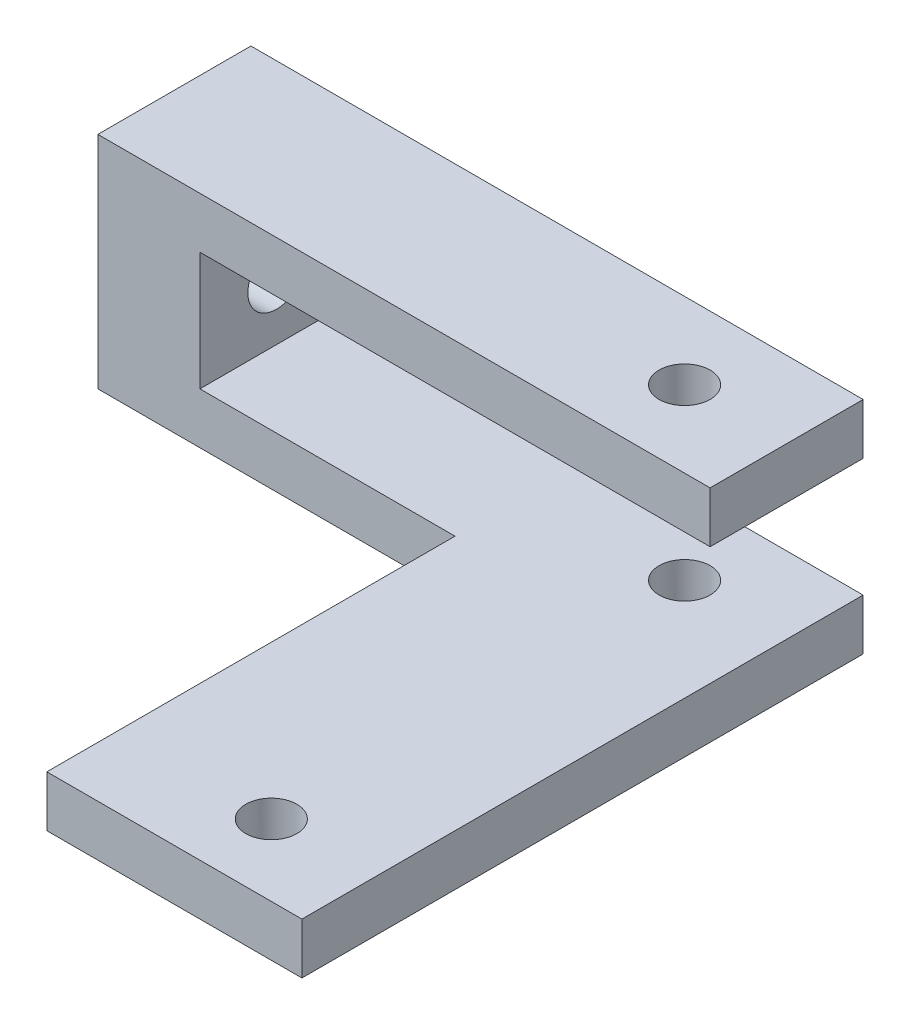
ISO-10303-21;
HEADER;
FILE_DESCRIPTION(('STEP AP214'),'2;1');
FILE_NAME('part.step','',(''),(''),'','','');
FILE_SCHEMA(('AUTOMOTIVE_DESIGN { 1 0 10303 214 1 1 1 1 }'));
ENDSEC;
DATA;
#1=APPLICATION_CONTEXT('core data for automotive mechanical design processes');
#2=APPLICATION_PROTOCOL_DEFINITION('international standard','automotive_design',2000,#1);
#3=PRODUCT_CONTEXT('',#1,'mechanical');
#4=PRODUCT('Part','Part','',(#3));
#5=PRODUCT_RELATED_PRODUCT_CATEGORY('part','',(#4));
#6=PRODUCT_DEFINITION_FORMATION('','',#4);
#7=PRODUCT_DEFINITION_CONTEXT('part definition',#1,'design');
#8=PRODUCT_DEFINITION('design','',#6,#7);
#9=PRODUCT_DEFINITION_SHAPE('','',#8);
#10=(LENGTH_UNIT() NAMED_UNIT(*) SI_UNIT(.MILLI.,.METRE.));
#11=(NAMED_UNIT(*) PLANE_ANGLE_UNIT() SI_UNIT($,.RADIAN.));
#12=(NAMED_UNIT(*) SI_UNIT($,.STERADIAN.) SOLID_ANGLE_UNIT());
#13=UNCERTAINTY_MEASURE_WITH_UNIT(LENGTH_MEASURE(1.E-05),#10,'distance_accuracy_value','');
#14=(GEOMETRIC_REPRESENTATION_CONTEXT(3) GLOBAL_UNCERTAINTY_ASSIGNED_CONTEXT((#13)) GLOBAL_UNIT_ASSIGNED_CONTEXT((#10,
#11,#12)) REPRESENTATION_CONTEXT('',''));
#15=CARTESIAN_POINT('',(0.,0.,0.));
#16=DIRECTION('',(0.,0.,1.));
#17=DIRECTION('',(1.,0.,0.));
#18=AXIS2_PLACEMENT_3D('',#15,#16,#17);
#19=CARTESIAN_POINT('',(0.,0.,19.05));
#20=DIRECTION('',(1.,0.,0.));
#21=DIRECTION('',(0.,1.,0.));
#22=AXIS2_PLACEMENT_3D('',#19,#20,#21);
#23=PLANE('',#22);
#24=CARTESIAN_POINT('',(0.,-13.716,9.525));
#25=DIRECTION('',(-1.,0.,0.));
#26=DIRECTION('',(0.,0.,1.));
#27=AXIS2_PLACEMENT_3D('',#24,#25,#26);
#28=CIRCLE('',#27,3.556);
#29=CARTESIAN_POINT('',(0.,-13.716,13.081));
#30=VERTEX_POINT('',#29);
#31=EDGE_CURVE('E288',#30,#30,#28,.T.);
#32=ORIENTED_EDGE('',*,*,#31,.F.);
#33=EDGE_LOOP('',(#32));
#34=FACE_BOUND('',#33,.T.);
#35=DIRECTION('',(0.,-1.,0.));
#36=VECTOR('',#35,1.);
#37=CARTESIAN_POINT('',(0.,0.,0.));
#38=LINE('',#37,#36);
#39=CARTESIAN_POINT('',(0.,0.,0.));
#40=VERTEX_POINT('',#39);
#41=CARTESIAN_POINT('',(0.,-27.432,0.));
#42=VERTEX_POINT('',#41);
#43=EDGE_CURVE('E148',#40,#42,#38,.T.);
#44=ORIENTED_EDGE('',*,*,#43,.T.);
#45=DIRECTION('',(0.,0.,-1.));
#46=VECTOR('',#45,1.);
#47=CARTESIAN_POINT('',(0.,-27.432,19.05));
#48=LINE('',#47,#46);
#49=CARTESIAN_POINT('',(0.,-27.432,19.05));
#50=VERTEX_POINT('',#49);
#51=EDGE_CURVE('E11',#50,#42,#48,.T.);
#52=ORIENTED_EDGE('',*,*,#51,.F.);
#53=DIRECTION('',(0.,-1.,0.));
#54=VECTOR('',#53,1.);
#55=CARTESIAN_POINT('',(0.,0.,19.05));
#56=LINE('',#55,#54);
#57=CARTESIAN_POINT('',(0.,0.,19.05));
#58=VERTEX_POINT('',#57);
#59=EDGE_CURVE('E172',#58,#50,#56,.T.);
#60=ORIENTED_EDGE('',*,*,#59,.F.);
#61=DIRECTION('',(0.,0.,-1.));
#62=VECTOR('',#61,1.);
#63=CARTESIAN_POINT('',(0.,0.,19.05));
#64=LINE('',#63,#62);
#65=EDGE_CURVE('E144',#58,#40,#64,.T.);
#66=ORIENTED_EDGE('',*,*,#65,.T.);
#67=EDGE_LOOP('',(#44,#52,#60,#66));
#68=FACE_BOUND('',#67,.T.);
#69=ADVANCED_FACE('F41',(#34,#68),#23,.F.);
#70=CARTESIAN_POINT('',(0.,-27.432,19.05));
#71=DIRECTION('',(0.,1.,0.));
#72=DIRECTION('',(0.,0.,1.));
#73=AXIS2_PLACEMENT_3D('',#70,#71,#72);
#74=PLANE('',#73);
#75=CARTESIAN_POINT('',(63.5,-27.432,60.96));
#76=DIRECTION('',(0.,1.,0.));
#77=DIRECTION('',(0.,0.,1.));
#78=AXIS2_PLACEMENT_3D('',#75,#76,#77);
#79=CIRCLE('',#78,3.175);
#80=CARTESIAN_POINT('',(63.5,-27.432,64.135));
#81=VERTEX_POINT('',#80);
#82=EDGE_CURVE('E206',#81,#81,#79,.T.);
#83=ORIENTED_EDGE('',*,*,#82,.T.);
#84=EDGE_LOOP('',(#83));
#85=FACE_BOUND('',#84,.T.);
#86=CARTESIAN_POINT('',(63.5,-27.432,9.525));
#87=DIRECTION('',(0.,1.,0.));
#88=DIRECTION('',(0.,0.,1.));
#89=AXIS2_PLACEMENT_3D('',#86,#87,#88);
#90=CIRCLE('',#89,3.175);
#91=CARTESIAN_POINT('',(63.5,-27.432,12.7));
#92=VERTEX_POINT('',#91);
#93=EDGE_CURVE('E299',#92,#92,#90,.T.);
#94=ORIENTED_EDGE('',*,*,#93,.T.);
#95=EDGE_LOOP('',(#94));
#96=FACE_BOUND('',#95,.T.);
#97=DIRECTION('',(1.,0.,0.));
#98=VECTOR('',#97,1.);
#99=CARTESIAN_POINT('',(0.,-27.432,0.));
#100=LINE('',#99,#98);
#101=CARTESIAN_POINT('',(76.2,-27.432,0.));
#102=VERTEX_POINT('',#101);
#103=EDGE_CURVE('E152',#42,#102,#100,.T.);
#104=ORIENTED_EDGE('',*,*,#103,.T.);
#105=DIRECTION('',(0.,0.,-1.));
#106=VECTOR('',#105,1.);
#107=CARTESIAN_POINT('',(76.2,-27.432,19.05));
#108=LINE('',#107,#106);
#109=CARTESIAN_POINT('',(76.2,-27.432,69.85));
#110=VERTEX_POINT('',#109);
#111=EDGE_CURVE('E50',#110,#102,#108,.T.);
#112=ORIENTED_EDGE('',*,*,#111,.F.);
#113=DIRECTION('',(1.,0.,0.));
#114=VECTOR('',#113,1.);
#115=CARTESIAN_POINT('',(44.45,-27.432,69.85));
#116=LINE('',#115,#114);
#117=CARTESIAN_POINT('',(44.45,-27.432,69.85));
#118=VERTEX_POINT('',#117);
#119=EDGE_CURVE('E213',#118,#110,#116,.T.);
#120=ORIENTED_EDGE('',*,*,#119,.F.);
#121=DIRECTION('',(0.,0.,-1.));
#122=VECTOR('',#121,1.);
#123=CARTESIAN_POINT('',(44.45,-27.432,69.85));
#124=LINE('',#123,#122);
#125=CARTESIAN_POINT('',(44.45,-27.432,19.05));
#126=VERTEX_POINT('',#125);
#127=EDGE_CURVE('E153',#118,#126,#124,.T.);
#128=ORIENTED_EDGE('',*,*,#127,.T.);
#129=DIRECTION('',(1.,0.,0.));
#130=VECTOR('',#129,1.);
#131=CARTESIAN_POINT('',(0.,-27.432,19.05));
#132=LINE('',#131,#130);
#133=EDGE_CURVE('E106',#50,#126,#132,.T.);
#134=ORIENTED_EDGE('',*,*,#133,.F.);
#135=ORIENTED_EDGE('',*,*,#51,.T.);
#136=EDGE_LOOP('',(#104,#112,#120,#128,#134,#135));
#137=FACE_BOUND('',#136,.T.);
#138=ADVANCED_FACE('F256',(#85,#96,#137),#74,.F.);
#139=CARTESIAN_POINT('',(76.2,-21.082,19.05));
#140=DIRECTION('',(-1.,0.,0.));
#141=DIRECTION('',(0.,0.,1.));
#142=AXIS2_PLACEMENT_3D('',#139,#140,#141);
#143=PLANE('',#142);
#144=DIRECTION('',(0.,1.,0.));
#145=VECTOR('',#144,1.);
#146=CARTESIAN_POINT('',(76.2,-21.082,0.));
#147=LINE('',#146,#145);
#148=CARTESIAN_POINT('',(76.2,-21.082,0.));
#149=VERTEX_POINT('',#148);
#150=EDGE_CURVE('E156',#102,#149,#147,.T.);
#151=ORIENTED_EDGE('',*,*,#150,.T.);
#152=DIRECTION('',(0.,0.,-1.));
#153=VECTOR('',#152,1.);
#154=CARTESIAN_POINT('',(76.2,-21.082,19.05));
#155=LINE('',#154,#153);
#156=CARTESIAN_POINT('',(76.2,-21.082,69.85));
#157=VERTEX_POINT('',#156);
#158=EDGE_CURVE('E183',#157,#149,#155,.T.);
#159=ORIENTED_EDGE('',*,*,#158,.F.);
#160=DIRECTION('',(0.,1.,0.));
#161=VECTOR('',#160,1.);
#162=CARTESIAN_POINT('',(76.2,-21.082,69.85));
#163=LINE('',#162,#161);
#164=EDGE_CURVE('E217',#110,#157,#163,.T.);
#165=ORIENTED_EDGE('',*,*,#164,.F.);
#166=ORIENTED_EDGE('',*,*,#111,.T.);
#167=EDGE_LOOP('',(#151,#159,#165,#166));
#168=FACE_BOUND('',#167,.T.);
#169=ADVANCED_FACE('F273',(#168),#143,.F.);
#170=CARTESIAN_POINT('',(12.7,-21.082,19.05));
#171=DIRECTION('',(0.,-1.,0.));
#172=DIRECTION('',(0.,0.,-1.));
#173=AXIS2_PLACEMENT_3D('',#170,#171,#172);
#174=PLANE('',#173);
#175=CARTESIAN_POINT('',(63.5,-21.082,60.96));
#176=DIRECTION('',(0.,-1.,0.));
#177=DIRECTION('',(0.,0.,-1.));
#178=AXIS2_PLACEMENT_3D('',#175,#176,#177);
#179=CIRCLE('',#178,3.175);
#180=CARTESIAN_POINT('',(63.5,-21.082,57.785));
#181=VERTEX_POINT('',#180);
#182=EDGE_CURVE('E189',#181,#181,#179,.T.);
#183=ORIENTED_EDGE('',*,*,#182,.T.);
#184=EDGE_LOOP('',(#183));
#185=FACE_BOUND('',#184,.T.);
#186=CARTESIAN_POINT('',(63.5,-21.082,9.525));
#187=DIRECTION('',(0.,-1.,0.));
#188=DIRECTION('',(0.,0.,-1.));
#189=AXIS2_PLACEMENT_3D('',#186,#187,#188);
#190=CIRCLE('',#189,3.175);
#191=CARTESIAN_POINT('',(63.5,-21.082,6.35000000000001));
#192=VERTEX_POINT('',#191);
#193=EDGE_CURVE('E192',#192,#192,#190,.T.);
#194=ORIENTED_EDGE('',*,*,#193,.T.);
#195=EDGE_LOOP('',(#194));
#196=FACE_BOUND('',#195,.T.);
#197=DIRECTION('',(-1.,0.,0.));
#198=VECTOR('',#197,1.);
#199=CARTESIAN_POINT('',(12.7,-21.082,0.));
#200=LINE('',#199,#198);
#201=CARTESIAN_POINT('',(12.7,-21.082,0.));
#202=VERTEX_POINT('',#201);
#203=EDGE_CURVE('E159',#149,#202,#200,.T.);
#204=ORIENTED_EDGE('',*,*,#203,.T.);
#205=DIRECTION('',(0.,0.,-1.));
#206=VECTOR('',#205,1.);
#207=CARTESIAN_POINT('',(12.7,-21.082,19.05));
#208=LINE('',#207,#206);
#209=CARTESIAN_POINT('',(12.7,-21.082,19.05));
#210=VERTEX_POINT('',#209);
#211=EDGE_CURVE('E179',#210,#202,#208,.T.);
#212=ORIENTED_EDGE('',*,*,#211,.F.);
#213=DIRECTION('',(-1.,0.,0.));
#214=VECTOR('',#213,1.);
#215=CARTESIAN_POINT('',(12.7,-21.082,19.05));
#216=LINE('',#215,#214);
#217=CARTESIAN_POINT('',(44.45,-21.082,19.05));
#218=VERTEX_POINT('',#217);
#219=EDGE_CURVE('E235',#218,#210,#216,.T.);
#220=ORIENTED_EDGE('',*,*,#219,.F.);
#221=DIRECTION('',(0.,0.,-1.));
#222=VECTOR('',#221,1.);
#223=CARTESIAN_POINT('',(44.45,-21.082,69.85));
#224=LINE('',#223,#222);
#225=CARTESIAN_POINT('',(44.45,-21.082,69.85));
#226=VERTEX_POINT('',#225);
#227=EDGE_CURVE('E224',#226,#218,#224,.T.);
#228=ORIENTED_EDGE('',*,*,#227,.F.);
#229=DIRECTION('',(-1.,0.,0.));
#230=VECTOR('',#229,1.);
#231=CARTESIAN_POINT('',(44.45,-21.082,69.85));
#232=LINE('',#231,#230);
#233=EDGE_CURVE('E221',#157,#226,#232,.T.);
#234=ORIENTED_EDGE('',*,*,#233,.F.);
#235=ORIENTED_EDGE('',*,*,#158,.T.);
#236=EDGE_LOOP('',(#204,#212,#220,#228,#234,#235));
#237=FACE_BOUND('',#236,.T.);
#238=ADVANCED_FACE('F241',(#185,#196,#237),#174,.F.);
#239=CARTESIAN_POINT('',(12.7,-6.35,19.05));
#240=DIRECTION('',(-1.,0.,0.));
#241=DIRECTION('',(0.,0.,1.));
#242=AXIS2_PLACEMENT_3D('',#239,#240,#241);
#243=PLANE('',#242);
#244=CARTESIAN_POINT('',(12.7,-13.716,9.525));
#245=DIRECTION('',(-1.,0.,0.));
#246=DIRECTION('',(0.,0.,1.));
#247=AXIS2_PLACEMENT_3D('',#244,#245,#246);
#248=CIRCLE('',#247,3.556);
#249=CARTESIAN_POINT('',(12.7,-13.716,13.081));
#250=VERTEX_POINT('',#249);
#251=EDGE_CURVE('E44',#250,#250,#248,.T.);
#252=ORIENTED_EDGE('',*,*,#251,.T.);
#253=EDGE_LOOP('',(#252));
#254=FACE_BOUND('',#253,.T.);
#255=DIRECTION('',(0.,1.,0.));
#256=VECTOR('',#255,1.);
#257=CARTESIAN_POINT('',(12.7,-6.35,0.));
#258=LINE('',#257,#256);
#259=CARTESIAN_POINT('',(12.7,-6.35,0.));
#260=VERTEX_POINT('',#259);
#261=EDGE_CURVE('E162',#202,#260,#258,.T.);
#262=ORIENTED_EDGE('',*,*,#261,.T.);
#263=DIRECTION('',(0.,0.,-1.));
#264=VECTOR('',#263,1.);
#265=CARTESIAN_POINT('',(12.7,-6.35,19.05));
#266=LINE('',#265,#264);
#267=CARTESIAN_POINT('',(12.7,-6.35,19.05));
#268=VERTEX_POINT('',#267);
#269=EDGE_CURVE('E137',#268,#260,#266,.T.);
#270=ORIENTED_EDGE('',*,*,#269,.F.);
#271=DIRECTION('',(0.,1.,0.));
#272=VECTOR('',#271,1.);
#273=CARTESIAN_POINT('',(12.7,-6.35,19.05));
#274=LINE('',#273,#272);
#275=EDGE_CURVE('E123',#210,#268,#274,.T.);
#276=ORIENTED_EDGE('',*,*,#275,.F.);
#277=ORIENTED_EDGE('',*,*,#211,.T.);
#278=EDGE_LOOP('',(#262,#270,#276,#277));
#279=FACE_BOUND('',#278,.T.);
#280=ADVANCED_FACE('F245',(#254,#279),#243,.F.);
#281=CARTESIAN_POINT('',(12.7,-6.35,19.05));
#282=DIRECTION('',(0.,1.,0.));
#283=DIRECTION('',(0.,0.,1.));
#284=AXIS2_PLACEMENT_3D('',#281,#282,#283);
#285=PLANE('',#284);
#286=CARTESIAN_POINT('',(63.5,-6.35,9.525));
#287=DIRECTION('',(0.,1.,0.));
#288=DIRECTION('',(0.,0.,1.));
#289=AXIS2_PLACEMENT_3D('',#286,#287,#288);
#290=CIRCLE('',#289,3.175);
#291=CARTESIAN_POINT('',(63.5,-6.35,12.7));
#292=VERTEX_POINT('',#291);
#293=EDGE_CURVE('E200',#292,#292,#290,.T.);
#294=ORIENTED_EDGE('',*,*,#293,.T.);
#295=EDGE_LOOP('',(#294));
#296=FACE_BOUND('',#295,.T.);
#297=DIRECTION('',(1.,0.,0.));
#298=VECTOR('',#297,1.);
#299=CARTESIAN_POINT('',(12.7,-6.35,0.));
#300=LINE('',#299,#298);
#301=CARTESIAN_POINT('',(76.2,-6.35,0.));
#302=VERTEX_POINT('',#301);
#303=EDGE_CURVE('E133',#260,#302,#300,.T.);
#304=ORIENTED_EDGE('',*,*,#303,.T.);
#305=DIRECTION('',(0.,0.,-1.));
#306=VECTOR('',#305,1.);
#307=CARTESIAN_POINT('',(76.2,-6.35,19.05));
#308=LINE('',#307,#306);
#309=CARTESIAN_POINT('',(76.2,-6.35,19.05));
#310=VERTEX_POINT('',#309);
#311=EDGE_CURVE('E130',#310,#302,#308,.T.);
#312=ORIENTED_EDGE('',*,*,#311,.F.);
#313=DIRECTION('',(1.,0.,0.));
#314=VECTOR('',#313,1.);
#315=CARTESIAN_POINT('',(12.7,-6.35,19.05));
#316=LINE('',#315,#314);
#317=EDGE_CURVE('E116',#268,#310,#316,.T.);
#318=ORIENTED_EDGE('',*,*,#317,.F.);
#319=ORIENTED_EDGE('',*,*,#269,.T.);
#320=EDGE_LOOP('',(#304,#312,#318,#319));
#321=FACE_BOUND('',#320,.T.);
#322=ADVANCED_FACE('F131',(#296,#321),#285,.F.);
#323=CARTESIAN_POINT('',(76.2,0.,19.05));
#324=DIRECTION('',(-1.,0.,0.));
#325=DIRECTION('',(0.,0.,1.));
#326=AXIS2_PLACEMENT_3D('',#323,#324,#325);
#327=PLANE('',#326);
#328=DIRECTION('',(0.,1.,0.));
#329=VECTOR('',#328,1.);
#330=CARTESIAN_POINT('',(76.2,0.,0.));
#331=LINE('',#330,#329);
#332=CARTESIAN_POINT('',(76.2,0.,0.));
#333=VERTEX_POINT('',#332);
#334=EDGE_CURVE('E167',#302,#333,#331,.T.);
#335=ORIENTED_EDGE('',*,*,#334,.T.);
#336=DIRECTION('',(0.,0.,-1.));
#337=VECTOR('',#336,1.);
#338=CARTESIAN_POINT('',(76.2,0.,19.05));
#339=LINE('',#338,#337);
#340=CARTESIAN_POINT('',(76.2,0.,19.05));
#341=VERTEX_POINT('',#340);
#342=EDGE_CURVE('E138',#341,#333,#339,.T.);
#343=ORIENTED_EDGE('',*,*,#342,.F.);
#344=DIRECTION('',(0.,1.,0.));
#345=VECTOR('',#344,1.);
#346=CARTESIAN_POINT('',(76.2,0.,19.05));
#347=LINE('',#346,#345);
#348=EDGE_CURVE('E120',#310,#341,#347,.T.);
#349=ORIENTED_EDGE('',*,*,#348,.F.);
#350=ORIENTED_EDGE('',*,*,#311,.T.);
#351=EDGE_LOOP('',(#335,#343,#349,#350));
#352=FACE_BOUND('',#351,.T.);
#353=ADVANCED_FACE('F140',(#352),#327,.F.);
#354=CARTESIAN_POINT('',(0.,0.,19.05));
#355=DIRECTION('',(0.,-1.,0.));
#356=DIRECTION('',(0.,0.,-1.));
#357=AXIS2_PLACEMENT_3D('',#354,#355,#356);
#358=PLANE('',#357);
#359=CARTESIAN_POINT('',(63.5,0.,9.525));
#360=DIRECTION('',(0.,1.,0.));
#361=DIRECTION('',(0.,0.,1.));
#362=AXIS2_PLACEMENT_3D('',#359,#360,#361);
#363=CIRCLE('',#362,3.175);
#364=CARTESIAN_POINT('',(63.5,0.,12.7));
#365=VERTEX_POINT('',#364);
#366=EDGE_CURVE('E294',#365,#365,#363,.T.);
#367=ORIENTED_EDGE('',*,*,#366,.F.);
#368=EDGE_LOOP('',(#367));
#369=FACE_BOUND('',#368,.T.);
#370=DIRECTION('',(-1.,0.,0.));
#371=VECTOR('',#370,1.);
#372=CARTESIAN_POINT('',(0.,0.,0.));
#373=LINE('',#372,#371);
#374=EDGE_CURVE('E99',#333,#40,#373,.T.);
#375=ORIENTED_EDGE('',*,*,#374,.T.);
#376=ORIENTED_EDGE('',*,*,#65,.F.);
#377=DIRECTION('',(-1.,0.,0.));
#378=VECTOR('',#377,1.);
#379=CARTESIAN_POINT('',(0.,0.,19.05));
#380=LINE('',#379,#378);
#381=EDGE_CURVE('E66',#341,#58,#380,.T.);
#382=ORIENTED_EDGE('',*,*,#381,.F.);
#383=ORIENTED_EDGE('',*,*,#342,.T.);
#384=EDGE_LOOP('',(#375,#376,#382,#383));
#385=FACE_BOUND('',#384,.T.);
#386=ADVANCED_FACE('F249',(#369,#385),#358,.F.);
#387=CARTESIAN_POINT('',(0.,0.,19.05));
#388=DIRECTION('',(0.,0.,1.));
#389=DIRECTION('',(1.,0.,0.));
#390=AXIS2_PLACEMENT_3D('',#387,#388,#389);
#391=PLANE('',#390);
#392=DIRECTION('',(0.,-1.,0.));
#393=VECTOR('',#392,1.);
#394=CARTESIAN_POINT('',(44.45,-21.082,19.05));
#395=LINE('',#394,#393);
#396=EDGE_CURVE('E58',#218,#126,#395,.T.);
#397=ORIENTED_EDGE('',*,*,#396,.F.);
#398=ORIENTED_EDGE('',*,*,#219,.T.);
#399=ORIENTED_EDGE('',*,*,#275,.T.);
#400=ORIENTED_EDGE('',*,*,#317,.T.);
#401=ORIENTED_EDGE('',*,*,#348,.T.);
#402=ORIENTED_EDGE('',*,*,#381,.T.);
#403=ORIENTED_EDGE('',*,*,#59,.T.);
#404=ORIENTED_EDGE('',*,*,#133,.T.);
#405=EDGE_LOOP('',(#397,#398,#399,#400,#401,#402,#403,#404));
#406=FACE_BOUND('',#405,.T.);
#407=ADVANCED_FACE('F118',(#406),#391,.T.);
#408=CARTESIAN_POINT('',(0.,0.,0.));
#409=DIRECTION('',(0.,0.,1.));
#410=DIRECTION('',(1.,0.,0.));
#411=AXIS2_PLACEMENT_3D('',#408,#409,#410);
#412=PLANE('',#411);
#413=ORIENTED_EDGE('',*,*,#43,.F.);
#414=ORIENTED_EDGE('',*,*,#374,.F.);
#415=ORIENTED_EDGE('',*,*,#334,.F.);
#416=ORIENTED_EDGE('',*,*,#303,.F.);
#417=ORIENTED_EDGE('',*,*,#261,.F.);
#418=ORIENTED_EDGE('',*,*,#203,.F.);
#419=ORIENTED_EDGE('',*,*,#150,.F.);
#420=ORIENTED_EDGE('',*,*,#103,.F.);
#421=EDGE_LOOP('',(#413,#414,#415,#416,#417,#418,#419,#420));
#422=FACE_BOUND('',#421,.T.);
#423=ADVANCED_FACE('F248',(#422),#412,.F.);
#424=CARTESIAN_POINT('',(44.45,-21.082,69.85));
#425=DIRECTION('',(1.,0.,0.));
#426=DIRECTION('',(0.,0.,-1.));
#427=AXIS2_PLACEMENT_3D('',#424,#425,#426);
#428=PLANE('',#427);
#429=ORIENTED_EDGE('',*,*,#396,.T.);
#430=ORIENTED_EDGE('',*,*,#127,.F.);
#431=DIRECTION('',(0.,-1.,0.));
#432=VECTOR('',#431,1.);
#433=CARTESIAN_POINT('',(44.45,-21.082,69.85));
#434=LINE('',#433,#432);
#435=EDGE_CURVE('E197',#226,#118,#434,.T.);
#436=ORIENTED_EDGE('',*,*,#435,.F.);
#437=ORIENTED_EDGE('',*,*,#227,.T.);
#438=EDGE_LOOP('',(#429,#430,#436,#437));
#439=FACE_BOUND('',#438,.T.);
#440=ADVANCED_FACE('F260',(#439),#428,.F.);
#441=CARTESIAN_POINT('',(0.,0.,69.85));
#442=DIRECTION('',(0.,0.,1.));
#443=DIRECTION('',(1.,0.,0.));
#444=AXIS2_PLACEMENT_3D('',#441,#442,#443);
#445=PLANE('',#444);
#446=ORIENTED_EDGE('',*,*,#435,.T.);
#447=ORIENTED_EDGE('',*,*,#119,.T.);
#448=ORIENTED_EDGE('',*,*,#164,.T.);
#449=ORIENTED_EDGE('',*,*,#233,.T.);
#450=EDGE_LOOP('',(#446,#447,#448,#449));
#451=FACE_BOUND('',#450,.T.);
#452=ADVANCED_FACE('F272',(#451),#445,.T.);
#453=CARTESIAN_POINT('',(63.5,-27.432,9.525));
#454=DIRECTION('',(0.,1.,0.));
#455=DIRECTION('',(0.,0.,1.));
#456=AXIS2_PLACEMENT_3D('',#453,#454,#455);
#457=CYLINDRICAL_SURFACE('',#456,3.175);
#458=ORIENTED_EDGE('',*,*,#366,.T.);
#459=EDGE_LOOP('',(#458));
#460=FACE_BOUND('',#459,.T.);
#461=ORIENTED_EDGE('',*,*,#293,.F.);
#462=EDGE_LOOP('',(#461));
#463=FACE_BOUND('',#462,.T.);
#464=ADVANCED_FACE('F311',(#460,#463),#457,.F.);
#465=ORIENTED_EDGE('',*,*,#93,.F.);
#466=EDGE_LOOP('',(#465));
#467=FACE_BOUND('',#466,.T.);
#468=ORIENTED_EDGE('',*,*,#193,.F.);
#469=EDGE_LOOP('',(#468));
#470=FACE_BOUND('',#469,.T.);
#471=ADVANCED_FACE('F307',(#467,#470),#457,.F.);
#472=CARTESIAN_POINT('',(63.5,-27.432,60.96));
#473=DIRECTION('',(0.,1.,0.));
#474=DIRECTION('',(0.,0.,1.));
#475=AXIS2_PLACEMENT_3D('',#472,#473,#474);
#476=CYLINDRICAL_SURFACE('',#475,3.175);
#477=ORIENTED_EDGE('',*,*,#82,.F.);
#478=EDGE_LOOP('',(#477));
#479=FACE_BOUND('',#478,.T.);
#480=ORIENTED_EDGE('',*,*,#182,.F.);
#481=EDGE_LOOP('',(#480));
#482=FACE_BOUND('',#481,.T.);
#483=ADVANCED_FACE('F310',(#479,#482),#476,.F.);
#484=CARTESIAN_POINT('',(50.8,-13.716,9.525));
#485=DIRECTION('',(-1.,0.,0.));
#486=DIRECTION('',(0.,0.,1.));
#487=AXIS2_PLACEMENT_3D('',#484,#485,#486);
#488=CYLINDRICAL_SURFACE('',#487,3.556);
#489=ORIENTED_EDGE('',*,*,#31,.T.);
#490=EDGE_LOOP('',(#489));
#491=FACE_BOUND('',#490,.T.);
#492=ORIENTED_EDGE('',*,*,#251,.F.);
#493=EDGE_LOOP('',(#492));
#494=FACE_BOUND('',#493,.T.);
#495=ADVANCED_FACE('F317',(#491,#494),#488,.F.);
#496=CLOSED_SHELL('',(#69,#138,#169,#238,#280,#322,#353,#386,#407,#423,#440,#452,#464,#471,#483,#495));
#497=MANIFOLD_SOLID_BREP('B2',#496);
#498=ADVANCED_BREP_SHAPE_REPRESENTATION('',(#18,#497),#14);
#499=SHAPE_DEFINITION_REPRESENTATION(#9,#498);
ENDSEC;
END-ISO-10303-21;
